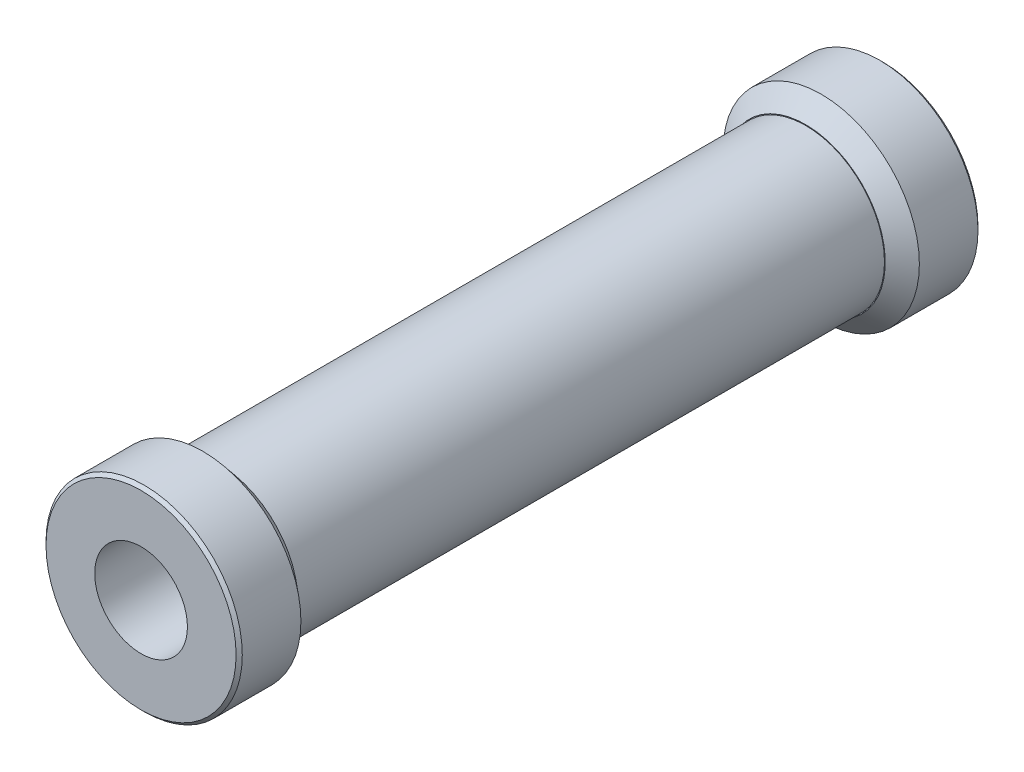
ISO-10303-21;
HEADER;
FILE_DESCRIPTION(('STEP AP214'),'2;1');
FILE_NAME('part.step','',(''),(''),'','','');
FILE_SCHEMA(('AUTOMOTIVE_DESIGN { 1 0 10303 214 1 1 1 1 }'));
ENDSEC;
DATA;
#1=APPLICATION_CONTEXT('core data for automotive mechanical design processes');
#2=APPLICATION_PROTOCOL_DEFINITION('international standard','automotive_design',2000,#1);
#3=PRODUCT_CONTEXT('',#1,'mechanical');
#4=PRODUCT('Part','Part','',(#3));
#5=PRODUCT_RELATED_PRODUCT_CATEGORY('part','',(#4));
#6=PRODUCT_DEFINITION_FORMATION('','',#4);
#7=PRODUCT_DEFINITION_CONTEXT('part definition',#1,'design');
#8=PRODUCT_DEFINITION('design','',#6,#7);
#9=PRODUCT_DEFINITION_SHAPE('','',#8);
#10=(LENGTH_UNIT() NAMED_UNIT(*) SI_UNIT(.MILLI.,.METRE.));
#11=(NAMED_UNIT(*) PLANE_ANGLE_UNIT() SI_UNIT($,.RADIAN.));
#12=(NAMED_UNIT(*) SI_UNIT($,.STERADIAN.) SOLID_ANGLE_UNIT());
#13=UNCERTAINTY_MEASURE_WITH_UNIT(LENGTH_MEASURE(1.E-05),#10,'distance_accuracy_value','');
#14=(GEOMETRIC_REPRESENTATION_CONTEXT(3) GLOBAL_UNCERTAINTY_ASSIGNED_CONTEXT((#13)) GLOBAL_UNIT_ASSIGNED_CONTEXT((#10,
#11,#12)) REPRESENTATION_CONTEXT('',''));
#15=CARTESIAN_POINT('',(0.,0.,0.));
#16=DIRECTION('',(0.,0.,1.));
#17=DIRECTION('',(1.,0.,0.));
#18=AXIS2_PLACEMENT_3D('',#15,#16,#17);
#19=CARTESIAN_POINT('',(0.,0.,15.5449330783939));
#20=DIRECTION('',(0.,0.,1.));
#21=DIRECTION('',(1.,0.,0.));
#22=AXIS2_PLACEMENT_3D('',#19,#20,#21);
#23=CYLINDRICAL_SURFACE('',#22,2.55);
#24=CARTESIAN_POINT('',(0.,0.,9.5));
#25=DIRECTION('',(0.,0.,1.));
#26=DIRECTION('',(1.,0.,0.));
#27=AXIS2_PLACEMENT_3D('',#24,#25,#26);
#28=CIRCLE('',#27,2.55);
#29=CARTESIAN_POINT('',(2.55,0.,9.5));
#30=VERTEX_POINT('',#29);
#31=EDGE_CURVE('E68',#30,#30,#28,.T.);
#32=ORIENTED_EDGE('',*,*,#31,.F.);
#33=EDGE_LOOP('',(#32));
#34=FACE_BOUND('',#33,.T.);
#35=CARTESIAN_POINT('',(0.,0.,-9.5));
#36=DIRECTION('',(0.,0.,1.));
#37=DIRECTION('',(1.,0.,0.));
#38=AXIS2_PLACEMENT_3D('',#35,#36,#37);
#39=CIRCLE('',#38,2.55);
#40=CARTESIAN_POINT('',(2.55,0.,-9.5));
#41=VERTEX_POINT('',#40);
#42=EDGE_CURVE('E79',#41,#41,#39,.T.);
#43=ORIENTED_EDGE('',*,*,#42,.T.);
#44=EDGE_LOOP('',(#43));
#45=FACE_BOUND('',#44,.T.);
#46=ADVANCED_FACE('F43',(#34,#45),#23,.T.);
#47=CARTESIAN_POINT('',(0.,0.,-9.5));
#48=DIRECTION('',(0.,0.,-1.));
#49=DIRECTION('',(-1.,0.,0.));
#50=AXIS2_PLACEMENT_3D('',#47,#48,#49);
#51=CONICAL_SURFACE('',#50,2.575,0.872664625997167);
#52=CARTESIAN_POINT('',(0.,0.,-10.0034597787064));
#53=DIRECTION('',(0.,0.,-1.));
#54=DIRECTION('',(-1.,0.,0.));
#55=AXIS2_PLACEMENT_3D('',#52,#53,#54);
#56=CIRCLE('',#55,3.175);
#57=CARTESIAN_POINT('',(3.175,0.,-10.0034597787064));
#58=VERTEX_POINT('',#57);
#59=EDGE_CURVE('E75',#58,#58,#56,.T.);
#60=ORIENTED_EDGE('',*,*,#59,.F.);
#61=EDGE_LOOP('',(#60));
#62=FACE_BOUND('',#61,.T.);
#63=CARTESIAN_POINT('',(0.,0.,-9.5));
#64=DIRECTION('',(0.,0.,-1.));
#65=DIRECTION('',(-1.,0.,0.));
#66=AXIS2_PLACEMENT_3D('',#63,#64,#65);
#67=CIRCLE('',#66,2.575);
#68=CARTESIAN_POINT('',(-2.575,0.,-9.5));
#69=VERTEX_POINT('',#68);
#70=EDGE_CURVE('E73',#69,#69,#67,.T.);
#71=ORIENTED_EDGE('',*,*,#70,.T.);
#72=EDGE_LOOP('',(#71));
#73=FACE_BOUND('',#72,.T.);
#74=ADVANCED_FACE('F117',(#62,#73),#51,.T.);
#75=CARTESIAN_POINT('',(0.,0.,-9.5));
#76=DIRECTION('',(0.,0.,-1.));
#77=DIRECTION('',(-1.,0.,0.));
#78=AXIS2_PLACEMENT_3D('',#75,#76,#77);
#79=PLANE('',#78);
#80=ORIENTED_EDGE('',*,*,#42,.F.);
#81=EDGE_LOOP('',(#80));
#82=FACE_BOUND('',#81,.T.);
#83=ORIENTED_EDGE('',*,*,#70,.F.);
#84=EDGE_LOOP('',(#83));
#85=FACE_BOUND('',#84,.T.);
#86=ADVANCED_FACE('F123',(#82,#85),#79,.F.);
#87=CARTESIAN_POINT('',(0.,0.,-12.));
#88=DIRECTION('',(0.,0.,1.));
#89=DIRECTION('',(1.,0.,0.));
#90=AXIS2_PLACEMENT_3D('',#87,#88,#89);
#91=CYLINDRICAL_SURFACE('',#90,3.175);
#92=CARTESIAN_POINT('',(0.,0.,-11.9));
#93=DIRECTION('',(0.,0.,-1.));
#94=DIRECTION('',(-1.,0.,0.));
#95=AXIS2_PLACEMENT_3D('',#92,#93,#94);
#96=CIRCLE('',#95,3.175);
#97=CARTESIAN_POINT('',(3.175,0.,-11.9));
#98=VERTEX_POINT('',#97);
#99=EDGE_CURVE('E57',#98,#98,#96,.F.);
#100=CARTESIAN_POINT('',(3.175,0.,-11.9));
#101=CARTESIAN_POINT('',(3.175,0.,-11.8802443726949));
#102=CARTESIAN_POINT('',(3.175,0.,-11.8604887453897));
#103=CARTESIAN_POINT('',(3.175,0.,-11.8209774907794));
#104=CARTESIAN_POINT('',(3.175,0.,-11.8012218634743));
#105=CARTESIAN_POINT('',(3.175,0.,-11.761710608864));
#106=CARTESIAN_POINT('',(3.175,0.,-11.7419549815589));
#107=CARTESIAN_POINT('',(3.175,0.,-11.7024437269486));
#108=CARTESIAN_POINT('',(3.175,0.,-11.6826880996434));
#109=CARTESIAN_POINT('',(3.175,0.,-11.6431768450332));
#110=CARTESIAN_POINT('',(3.175,0.,-11.623421217728));
#111=CARTESIAN_POINT('',(3.175,0.,-11.5839099631177));
#112=CARTESIAN_POINT('',(3.175,0.,-11.5641543358126));
#113=CARTESIAN_POINT('',(3.175,0.,-11.5246430812023));
#114=CARTESIAN_POINT('',(3.175,0.,-11.5048874538972));
#115=CARTESIAN_POINT('',(3.175,0.,-11.4653761992869));
#116=CARTESIAN_POINT('',(3.175,0.,-11.4456205719817));
#117=CARTESIAN_POINT('',(3.175,0.,-11.4061093173715));
#118=CARTESIAN_POINT('',(3.175,0.,-11.3863536900663));
#119=CARTESIAN_POINT('',(3.175,0.,-11.346842435456));
#120=CARTESIAN_POINT('',(3.175,0.,-11.3270868081509));
#121=CARTESIAN_POINT('',(3.175,0.,-11.2875755535406));
#122=CARTESIAN_POINT('',(3.175,0.,-11.2678199262355));
#123=CARTESIAN_POINT('',(3.175,0.,-11.2283086716252));
#124=CARTESIAN_POINT('',(3.175,0.,-11.20855304432));
#125=CARTESIAN_POINT('',(3.175,0.,-11.1690417897098));
#126=CARTESIAN_POINT('',(3.175,0.,-11.1492861624046));
#127=CARTESIAN_POINT('',(3.175,0.,-11.1097749077943));
#128=CARTESIAN_POINT('',(3.175,0.,-11.0900192804892));
#129=CARTESIAN_POINT('',(3.175,0.,-11.0505080258789));
#130=CARTESIAN_POINT('',(3.175,0.,-11.0307523985738));
#131=CARTESIAN_POINT('',(3.175,0.,-10.9912411439635));
#132=CARTESIAN_POINT('',(3.175,0.,-10.9714855166583));
#133=CARTESIAN_POINT('',(3.175,0.,-10.931974262048));
#134=CARTESIAN_POINT('',(3.175,0.,-10.9122186347429));
#135=CARTESIAN_POINT('',(3.175,0.,-10.8727073801326));
#136=CARTESIAN_POINT('',(3.175,0.,-10.8529517528275));
#137=CARTESIAN_POINT('',(3.175,0.,-10.8134404982172));
#138=CARTESIAN_POINT('',(3.175,0.,-10.7936848709121));
#139=CARTESIAN_POINT('',(3.175,0.,-10.7541736163018));
#140=CARTESIAN_POINT('',(3.175,0.,-10.7344179889966));
#141=CARTESIAN_POINT('',(3.175,0.,-10.6949067343863));
#142=CARTESIAN_POINT('',(3.175,0.,-10.6751511070812));
#143=CARTESIAN_POINT('',(3.175,0.,-10.6356398524709));
#144=CARTESIAN_POINT('',(3.175,0.,-10.6158842251658));
#145=CARTESIAN_POINT('',(3.175,0.,-10.5763729705555));
#146=CARTESIAN_POINT('',(3.175,0.,-10.5566173432503));
#147=CARTESIAN_POINT('',(3.175,0.,-10.5171060886401));
#148=CARTESIAN_POINT('',(3.175,0.,-10.4973504613349));
#149=CARTESIAN_POINT('',(3.175,0.,-10.4578392067246));
#150=CARTESIAN_POINT('',(3.175,0.,-10.4380835794195));
#151=CARTESIAN_POINT('',(3.175,0.,-10.3985723248092));
#152=CARTESIAN_POINT('',(3.175,0.,-10.3788166975041));
#153=CARTESIAN_POINT('',(3.175,0.,-10.3393054428938));
#154=CARTESIAN_POINT('',(3.175,0.,-10.3195498155886));
#155=CARTESIAN_POINT('',(3.175,0.,-10.2800385609784));
#156=CARTESIAN_POINT('',(3.175,0.,-10.2602829336732));
#157=CARTESIAN_POINT('',(3.175,0.,-10.2207716790629));
#158=CARTESIAN_POINT('',(3.175,0.,-10.2010160517578));
#159=CARTESIAN_POINT('',(3.175,0.,-10.1615047971475));
#160=CARTESIAN_POINT('',(3.175,0.,-10.1417491698424));
#161=CARTESIAN_POINT('',(3.175,0.,-10.1022379152321));
#162=CARTESIAN_POINT('',(3.175,0.,-10.0824822879269));
#163=CARTESIAN_POINT('',(3.175,0.,-10.0429710333166));
#164=CARTESIAN_POINT('',(3.175,0.,-10.0232154060115));
#165=CARTESIAN_POINT('',(3.175,0.,-10.0034597787064));
#166=B_SPLINE_CURVE_WITH_KNOTS('',3,(#100,#101,#102,#103,#104,#105,#106,#107,#108,#109,#110,
#111,#112,#113,#114,#115,#116,#117,#118,#119,#120,#121,#122,#123,#124,#125,#126,#127,#128,#129,
#130,#131,#132,#133,#134,#135,#136,#137,#138,#139,#140,#141,#142,#143,#144,#145,#146,#147,#148,
#149,#150,#151,#152,#153,#154,#155,#156,#157,#158,#159,#160,#161,#162,#163,#164,#165),
.UNSPECIFIED.,.F.,.F.,(4,2,2,2,2,2,2,2,2,2,2,2,2,2,2,2,2,2,2,2,2,2,2,2,2,2,2,2,2,2,2,2,4),(0.,
0.0592668819154249,0.118533763830852,0.177800645746278,0.237067527661705,0.296334409577131,
0.355601291492558,0.414868173407985,0.474135055323411,0.533401937238838,0.592668819154265,
0.651935701069691,0.711202582985118,0.770469464900544,0.829736346815971,0.889003228731398,
0.948270110646824,1.00753699256225,1.06680387447768,1.1260707563931,1.18533763830853,
1.24460452022396,1.30387140213938,1.36313828405481,1.42240516597024,1.48167204788566,
1.54093892980109,1.60020581171652,1.65947269363194,1.71873957554737,1.7780064574628,
1.83727333937822,1.89654022129365),.UNSPECIFIED.);
#167=EDGE_CURVE('BSEAM150',#98,#58,#166,.T.);
#168=ORIENTED_EDGE('',*,*,#99,.T.);
#169=ORIENTED_EDGE('',*,*,#59,.T.);
#170=ORIENTED_EDGE('',*,*,#167,.T.);
#171=ORIENTED_EDGE('',*,*,#167,.F.);
#172=EDGE_LOOP('',(#168,#170,#169,#171));
#173=FACE_BOUND('',#172,.T.);
#174=ADVANCED_FACE('F150',(#173),#91,.T.);
#175=CARTESIAN_POINT('',(0.,0.,-12.));
#176=DIRECTION('',(0.,0.,-1.));
#177=DIRECTION('',(-1.,0.,0.));
#178=AXIS2_PLACEMENT_3D('',#175,#176,#177);
#179=PLANE('',#178);
#180=CARTESIAN_POINT('',(0.,0.,-12.));
#181=DIRECTION('',(0.,0.,-1.));
#182=DIRECTION('',(-1.,0.,0.));
#183=AXIS2_PLACEMENT_3D('',#180,#181,#182);
#184=CIRCLE('',#183,3.07500000000001);
#185=CARTESIAN_POINT('',(-3.07500000000001,0.,-12.));
#186=VERTEX_POINT('',#185);
#187=EDGE_CURVE('E62',#186,#186,#184,.T.);
#188=ORIENTED_EDGE('',*,*,#187,.T.);
#189=EDGE_LOOP('',(#188));
#190=FACE_BOUND('',#189,.T.);
#191=CARTESIAN_POINT('',(0.,0.,-12.));
#192=DIRECTION('',(0.,0.,-1.));
#193=DIRECTION('',(-1.,0.,0.));
#194=AXIS2_PLACEMENT_3D('',#191,#192,#193);
#195=CIRCLE('',#194,1.5);
#196=CARTESIAN_POINT('',(-1.5,0.,-12.));
#197=VERTEX_POINT('',#196);
#198=EDGE_CURVE('E92',#197,#197,#195,.T.);
#199=ORIENTED_EDGE('',*,*,#198,.F.);
#200=EDGE_LOOP('',(#199));
#201=FACE_BOUND('',#200,.T.);
#202=ADVANCED_FACE('F133',(#190,#201),#179,.T.);
#203=CARTESIAN_POINT('',(0.,0.,9.5));
#204=DIRECTION('',(0.,0.,1.));
#205=DIRECTION('',(1.,0.,0.));
#206=AXIS2_PLACEMENT_3D('',#203,#204,#205);
#207=CONICAL_SURFACE('',#206,2.575,0.872664625997167);
#208=CARTESIAN_POINT('',(0.,0.,10.0034597787064));
#209=DIRECTION('',(0.,0.,1.));
#210=DIRECTION('',(1.,0.,0.));
#211=AXIS2_PLACEMENT_3D('',#208,#209,#210);
#212=CIRCLE('',#211,3.175);
#213=CARTESIAN_POINT('',(-3.175,0.,10.0034597787064));
#214=VERTEX_POINT('',#213);
#215=EDGE_CURVE('E69',#214,#214,#212,.T.);
#216=ORIENTED_EDGE('',*,*,#215,.F.);
#217=EDGE_LOOP('',(#216));
#218=FACE_BOUND('',#217,.T.);
#219=CARTESIAN_POINT('',(0.,0.,9.5));
#220=DIRECTION('',(0.,0.,1.));
#221=DIRECTION('',(1.,0.,0.));
#222=AXIS2_PLACEMENT_3D('',#219,#220,#221);
#223=CIRCLE('',#222,2.575);
#224=CARTESIAN_POINT('',(2.575,0.,9.5));
#225=VERTEX_POINT('',#224);
#226=EDGE_CURVE('E74',#225,#225,#223,.T.);
#227=ORIENTED_EDGE('',*,*,#226,.T.);
#228=EDGE_LOOP('',(#227));
#229=FACE_BOUND('',#228,.T.);
#230=ADVANCED_FACE('F131',(#218,#229),#207,.T.);
#231=CARTESIAN_POINT('',(0.,0.,9.5));
#232=DIRECTION('',(0.,0.,1.));
#233=DIRECTION('',(1.,0.,0.));
#234=AXIS2_PLACEMENT_3D('',#231,#232,#233);
#235=PLANE('',#234);
#236=ORIENTED_EDGE('',*,*,#31,.T.);
#237=EDGE_LOOP('',(#236));
#238=FACE_BOUND('',#237,.T.);
#239=ORIENTED_EDGE('',*,*,#226,.F.);
#240=EDGE_LOOP('',(#239));
#241=FACE_BOUND('',#240,.T.);
#242=ADVANCED_FACE('F114',(#238,#241),#235,.F.);
#243=CARTESIAN_POINT('',(0.,0.,12.));
#244=DIRECTION('',(0.,0.,-1.));
#245=DIRECTION('',(-1.,0.,0.));
#246=AXIS2_PLACEMENT_3D('',#243,#244,#245);
#247=CYLINDRICAL_SURFACE('',#246,3.175);
#248=CARTESIAN_POINT('',(0.,0.,11.9));
#249=DIRECTION('',(0.,0.,1.));
#250=DIRECTION('',(1.,0.,0.));
#251=AXIS2_PLACEMENT_3D('',#248,#249,#250);
#252=CIRCLE('',#251,3.175);
#253=CARTESIAN_POINT('',(-3.175,0.,11.9));
#254=VERTEX_POINT('',#253);
#255=EDGE_CURVE('E10',#254,#254,#252,.F.);
#256=CARTESIAN_POINT('',(-3.175,0.,11.9));
#257=CARTESIAN_POINT('',(-3.175,0.,11.8802443726949));
#258=CARTESIAN_POINT('',(-3.175,0.,11.8604887453897));
#259=CARTESIAN_POINT('',(-3.175,0.,11.8209774907794));
#260=CARTESIAN_POINT('',(-3.175,0.,11.8012218634743));
#261=CARTESIAN_POINT('',(-3.175,0.,11.761710608864));
#262=CARTESIAN_POINT('',(-3.175,0.,11.7419549815589));
#263=CARTESIAN_POINT('',(-3.175,0.,11.7024437269486));
#264=CARTESIAN_POINT('',(-3.175,0.,11.6826880996434));
#265=CARTESIAN_POINT('',(-3.175,0.,11.6431768450332));
#266=CARTESIAN_POINT('',(-3.175,0.,11.623421217728));
#267=CARTESIAN_POINT('',(-3.175,0.,11.5839099631177));
#268=CARTESIAN_POINT('',(-3.175,0.,11.5641543358126));
#269=CARTESIAN_POINT('',(-3.175,0.,11.5246430812023));
#270=CARTESIAN_POINT('',(-3.175,0.,11.5048874538972));
#271=CARTESIAN_POINT('',(-3.175,0.,11.4653761992869));
#272=CARTESIAN_POINT('',(-3.175,0.,11.4456205719817));
#273=CARTESIAN_POINT('',(-3.175,0.,11.4061093173715));
#274=CARTESIAN_POINT('',(-3.175,0.,11.3863536900663));
#275=CARTESIAN_POINT('',(-3.175,0.,11.346842435456));
#276=CARTESIAN_POINT('',(-3.175,0.,11.3270868081509));
#277=CARTESIAN_POINT('',(-3.175,0.,11.2875755535406));
#278=CARTESIAN_POINT('',(-3.175,0.,11.2678199262355));
#279=CARTESIAN_POINT('',(-3.175,0.,11.2283086716252));
#280=CARTESIAN_POINT('',(-3.175,0.,11.20855304432));
#281=CARTESIAN_POINT('',(-3.175,0.,11.1690417897098));
#282=CARTESIAN_POINT('',(-3.175,0.,11.1492861624046));
#283=CARTESIAN_POINT('',(-3.175,0.,11.1097749077943));
#284=CARTESIAN_POINT('',(-3.175,0.,11.0900192804892));
#285=CARTESIAN_POINT('',(-3.175,0.,11.0505080258789));
#286=CARTESIAN_POINT('',(-3.175,0.,11.0307523985738));
#287=CARTESIAN_POINT('',(-3.175,0.,10.9912411439635));
#288=CARTESIAN_POINT('',(-3.175,0.,10.9714855166583));
#289=CARTESIAN_POINT('',(-3.175,0.,10.931974262048));
#290=CARTESIAN_POINT('',(-3.175,0.,10.9122186347429));
#291=CARTESIAN_POINT('',(-3.175,0.,10.8727073801326));
#292=CARTESIAN_POINT('',(-3.175,0.,10.8529517528275));
#293=CARTESIAN_POINT('',(-3.175,0.,10.8134404982172));
#294=CARTESIAN_POINT('',(-3.175,0.,10.7936848709121));
#295=CARTESIAN_POINT('',(-3.175,0.,10.7541736163018));
#296=CARTESIAN_POINT('',(-3.175,0.,10.7344179889966));
#297=CARTESIAN_POINT('',(-3.175,0.,10.6949067343863));
#298=CARTESIAN_POINT('',(-3.175,0.,10.6751511070812));
#299=CARTESIAN_POINT('',(-3.175,0.,10.6356398524709));
#300=CARTESIAN_POINT('',(-3.175,0.,10.6158842251658));
#301=CARTESIAN_POINT('',(-3.175,0.,10.5763729705555));
#302=CARTESIAN_POINT('',(-3.175,0.,10.5566173432503));
#303=CARTESIAN_POINT('',(-3.175,0.,10.5171060886401));
#304=CARTESIAN_POINT('',(-3.175,0.,10.4973504613349));
#305=CARTESIAN_POINT('',(-3.175,0.,10.4578392067246));
#306=CARTESIAN_POINT('',(-3.175,0.,10.4380835794195));
#307=CARTESIAN_POINT('',(-3.175,0.,10.3985723248092));
#308=CARTESIAN_POINT('',(-3.175,0.,10.3788166975041));
#309=CARTESIAN_POINT('',(-3.175,0.,10.3393054428938));
#310=CARTESIAN_POINT('',(-3.175,0.,10.3195498155886));
#311=CARTESIAN_POINT('',(-3.175,0.,10.2800385609784));
#312=CARTESIAN_POINT('',(-3.175,0.,10.2602829336732));
#313=CARTESIAN_POINT('',(-3.175,0.,10.2207716790629));
#314=CARTESIAN_POINT('',(-3.175,0.,10.2010160517578));
#315=CARTESIAN_POINT('',(-3.175,0.,10.1615047971475));
#316=CARTESIAN_POINT('',(-3.175,0.,10.1417491698424));
#317=CARTESIAN_POINT('',(-3.175,0.,10.1022379152321));
#318=CARTESIAN_POINT('',(-3.175,0.,10.0824822879269));
#319=CARTESIAN_POINT('',(-3.175,0.,10.0429710333166));
#320=CARTESIAN_POINT('',(-3.175,0.,10.0232154060115));
#321=CARTESIAN_POINT('',(-3.175,0.,10.0034597787064));
#322=B_SPLINE_CURVE_WITH_KNOTS('',3,(#256,#257,#258,#259,#260,#261,#262,#263,#264,#265,#266,
#267,#268,#269,#270,#271,#272,#273,#274,#275,#276,#277,#278,#279,#280,#281,#282,#283,#284,#285,
#286,#287,#288,#289,#290,#291,#292,#293,#294,#295,#296,#297,#298,#299,#300,#301,#302,#303,#304,
#305,#306,#307,#308,#309,#310,#311,#312,#313,#314,#315,#316,#317,#318,#319,#320,#321),
.UNSPECIFIED.,.F.,.F.,(4,2,2,2,2,2,2,2,2,2,2,2,2,2,2,2,2,2,2,2,2,2,2,2,2,2,2,2,2,2,2,2,4),(0.,
0.0592668819154249,0.118533763830852,0.177800645746278,0.237067527661705,0.296334409577131,
0.355601291492558,0.414868173407985,0.474135055323411,0.533401937238838,0.592668819154265,
0.651935701069691,0.711202582985118,0.770469464900544,0.829736346815971,0.889003228731398,
0.948270110646824,1.00753699256225,1.06680387447768,1.1260707563931,1.18533763830853,
1.24460452022396,1.30387140213938,1.36313828405481,1.42240516597024,1.48167204788566,
1.54093892980109,1.60020581171652,1.65947269363194,1.71873957554737,1.7780064574628,
1.83727333937822,1.89654022129365),.UNSPECIFIED.);
#323=EDGE_CURVE('BSEAM105',#254,#214,#322,.T.);
#324=ORIENTED_EDGE('',*,*,#255,.T.);
#325=ORIENTED_EDGE('',*,*,#215,.T.);
#326=ORIENTED_EDGE('',*,*,#323,.T.);
#327=ORIENTED_EDGE('',*,*,#323,.F.);
#328=EDGE_LOOP('',(#324,#326,#325,#327));
#329=FACE_BOUND('',#328,.T.);
#330=ADVANCED_FACE('F105',(#329),#247,.T.);
#331=CARTESIAN_POINT('',(0.,0.,12.));
#332=DIRECTION('',(0.,0.,1.));
#333=DIRECTION('',(1.,0.,0.));
#334=AXIS2_PLACEMENT_3D('',#331,#332,#333);
#335=PLANE('',#334);
#336=CARTESIAN_POINT('',(0.,0.,12.));
#337=DIRECTION('',(0.,0.,1.));
#338=DIRECTION('',(1.,0.,0.));
#339=AXIS2_PLACEMENT_3D('',#336,#337,#338);
#340=CIRCLE('',#339,3.07500000000001);
#341=CARTESIAN_POINT('',(3.07500000000001,0.,12.));
#342=VERTEX_POINT('',#341);
#343=EDGE_CURVE('E52',#342,#342,#340,.T.);
#344=ORIENTED_EDGE('',*,*,#343,.T.);
#345=EDGE_LOOP('',(#344));
#346=FACE_BOUND('',#345,.T.);
#347=CARTESIAN_POINT('',(0.,0.,12.));
#348=DIRECTION('',(0.,0.,1.));
#349=DIRECTION('',(1.,0.,0.));
#350=AXIS2_PLACEMENT_3D('',#347,#348,#349);
#351=CIRCLE('',#350,1.5);
#352=CARTESIAN_POINT('',(1.5,0.,12.));
#353=VERTEX_POINT('',#352);
#354=EDGE_CURVE('E96',#353,#353,#351,.T.);
#355=ORIENTED_EDGE('',*,*,#354,.F.);
#356=EDGE_LOOP('',(#355));
#357=FACE_BOUND('',#356,.T.);
#358=ADVANCED_FACE('F103',(#346,#357),#335,.T.);
#359=CARTESIAN_POINT('',(0.,0.,-88.));
#360=DIRECTION('',(0.,0.,1.));
#361=DIRECTION('',(1.,0.,0.));
#362=AXIS2_PLACEMENT_3D('',#359,#360,#361);
#363=CYLINDRICAL_SURFACE('',#362,1.5);
#364=ORIENTED_EDGE('',*,*,#198,.T.);
#365=EDGE_LOOP('',(#364));
#366=FACE_BOUND('',#365,.T.);
#367=ORIENTED_EDGE('',*,*,#354,.T.);
#368=EDGE_LOOP('',(#367));
#369=FACE_BOUND('',#368,.T.);
#370=ADVANCED_FACE('F101',(#366,#369),#363,.F.);
#371=CARTESIAN_POINT('',(0.,0.,-12.));
#372=DIRECTION('',(0.,0.,1.));
#373=DIRECTION('',(1.,0.,0.));
#374=AXIS2_PLACEMENT_3D('',#371,#372,#373);
#375=CONICAL_SURFACE('',#374,3.07500000000001,0.785398163397446);
#376=ORIENTED_EDGE('',*,*,#99,.F.);
#377=EDGE_LOOP('',(#376));
#378=FACE_BOUND('',#377,.T.);
#379=ORIENTED_EDGE('',*,*,#187,.F.);
#380=EDGE_LOOP('',(#379));
#381=FACE_BOUND('',#380,.T.);
#382=ADVANCED_FACE('F111',(#378,#381),#375,.T.);
#383=CARTESIAN_POINT('',(0.,0.,12.));
#384=DIRECTION('',(0.,0.,-1.));
#385=DIRECTION('',(-1.,0.,0.));
#386=AXIS2_PLACEMENT_3D('',#383,#384,#385);
#387=CONICAL_SURFACE('',#386,3.07500000000001,0.785398163397446);
#388=ORIENTED_EDGE('',*,*,#255,.F.);
#389=EDGE_LOOP('',(#388));
#390=FACE_BOUND('',#389,.T.);
#391=ORIENTED_EDGE('',*,*,#343,.F.);
#392=EDGE_LOOP('',(#391));
#393=FACE_BOUND('',#392,.T.);
#394=ADVANCED_FACE('F46',(#390,#393),#387,.T.);
#395=CLOSED_SHELL('',(#46,#74,#86,#174,#202,#230,#242,#330,#358,#370,#382,#394));
#396=MANIFOLD_SOLID_BREP('B2',#395);
#397=ADVANCED_BREP_SHAPE_REPRESENTATION('',(#18,#396),#14);
#398=SHAPE_DEFINITION_REPRESENTATION(#9,#397);
ENDSEC;
END-ISO-10303-21;
